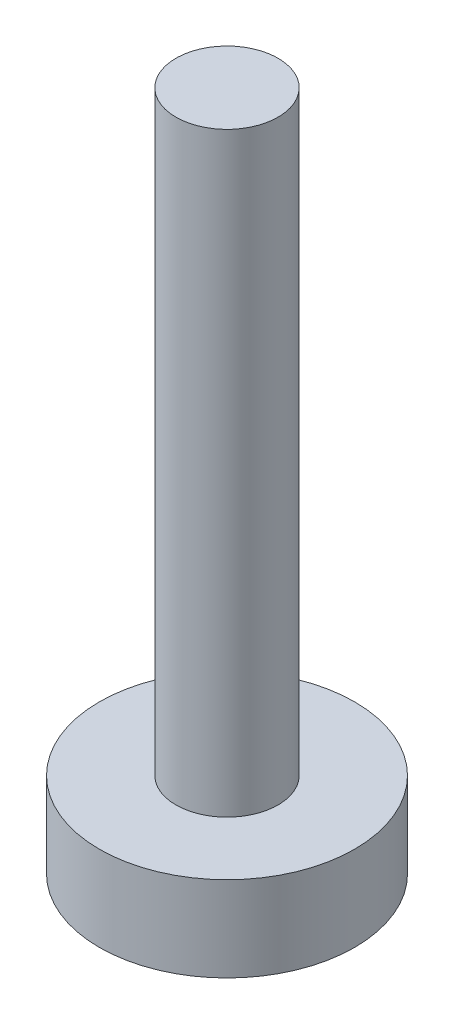
ISO-10303-21;
HEADER;
FILE_DESCRIPTION(('STEP AP214'),'2;1');
FILE_NAME('part.step','',(''),(''),'','','');
FILE_SCHEMA(('AUTOMOTIVE_DESIGN { 1 0 10303 214 1 1 1 1 }'));
ENDSEC;
DATA;
#1=APPLICATION_CONTEXT('core data for automotive mechanical design processes');
#2=APPLICATION_PROTOCOL_DEFINITION('international standard','automotive_design',2000,#1);
#3=PRODUCT_CONTEXT('',#1,'mechanical');
#4=PRODUCT('Part','Part','',(#3));
#5=PRODUCT_RELATED_PRODUCT_CATEGORY('part','',(#4));
#6=PRODUCT_DEFINITION_FORMATION('','',#4);
#7=PRODUCT_DEFINITION_CONTEXT('part definition',#1,'design');
#8=PRODUCT_DEFINITION('design','',#6,#7);
#9=PRODUCT_DEFINITION_SHAPE('','',#8);
#10=(LENGTH_UNIT() NAMED_UNIT(*) SI_UNIT(.MILLI.,.METRE.));
#11=(NAMED_UNIT(*) PLANE_ANGLE_UNIT() SI_UNIT($,.RADIAN.));
#12=(NAMED_UNIT(*) SI_UNIT($,.STERADIAN.) SOLID_ANGLE_UNIT());
#13=UNCERTAINTY_MEASURE_WITH_UNIT(LENGTH_MEASURE(1.E-05),#10,'distance_accuracy_value','');
#14=(GEOMETRIC_REPRESENTATION_CONTEXT(3) GLOBAL_UNCERTAINTY_ASSIGNED_CONTEXT((#13)) GLOBAL_UNIT_ASSIGNED_CONTEXT((#10,
#11,#12)) REPRESENTATION_CONTEXT('',''));
#15=CARTESIAN_POINT('',(0.,0.,0.));
#16=DIRECTION('',(0.,0.,1.));
#17=DIRECTION('',(1.,0.,0.));
#18=AXIS2_PLACEMENT_3D('',#15,#16,#17);
#19=CARTESIAN_POINT('',(0.,7.,0.));
#20=DIRECTION('',(0.,-1.,0.));
#21=DIRECTION('',(0.,0.,-1.));
#22=AXIS2_PLACEMENT_3D('',#19,#20,#21);
#23=CYLINDRICAL_SURFACE('',#22,0.6);
#24=CARTESIAN_POINT('',(0.,7.,0.));
#25=DIRECTION('',(0.,1.,0.));
#26=DIRECTION('',(0.,0.,1.));
#27=AXIS2_PLACEMENT_3D('',#24,#25,#26);
#28=CIRCLE('',#27,0.6);
#29=CARTESIAN_POINT('',(0.,7.,0.6));
#30=VERTEX_POINT('',#29);
#31=EDGE_CURVE('E10',#30,#30,#28,.T.);
#32=ORIENTED_EDGE('',*,*,#31,.F.);
#33=EDGE_LOOP('',(#32));
#34=FACE_BOUND('',#33,.T.);
#35=CARTESIAN_POINT('',(0.,0.,0.));
#36=DIRECTION('',(0.,1.,0.));
#37=DIRECTION('',(0.,0.,1.));
#38=AXIS2_PLACEMENT_3D('',#35,#36,#37);
#39=CIRCLE('',#38,0.6);
#40=CARTESIAN_POINT('',(0.,0.,0.6));
#41=VERTEX_POINT('',#40);
#42=EDGE_CURVE('E38',#41,#41,#39,.T.);
#43=ORIENTED_EDGE('',*,*,#42,.T.);
#44=EDGE_LOOP('',(#43));
#45=FACE_BOUND('',#44,.T.);
#46=ADVANCED_FACE('F35',(#34,#45),#23,.T.);
#47=CARTESIAN_POINT('',(0.,7.,0.));
#48=DIRECTION('',(0.,1.,0.));
#49=DIRECTION('',(0.,0.,1.));
#50=AXIS2_PLACEMENT_3D('',#47,#48,#49);
#51=PLANE('',#50);
#52=ORIENTED_EDGE('',*,*,#31,.T.);
#53=EDGE_LOOP('',(#52));
#54=FACE_BOUND('',#53,.T.);
#55=ADVANCED_FACE('F58',(#54),#51,.T.);
#56=CARTESIAN_POINT('',(0.,-1.,0.));
#57=DIRECTION('',(0.,1.,0.));
#58=DIRECTION('',(0.,0.,1.));
#59=AXIS2_PLACEMENT_3D('',#56,#57,#58);
#60=CYLINDRICAL_SURFACE('',#59,1.5);
#61=CARTESIAN_POINT('',(0.,-1.,0.));
#62=DIRECTION('',(0.,-1.,0.));
#63=DIRECTION('',(0.,0.,-1.));
#64=AXIS2_PLACEMENT_3D('',#61,#62,#63);
#65=CIRCLE('',#64,1.5);
#66=CARTESIAN_POINT('',(0.,-1.,-1.5));
#67=VERTEX_POINT('',#66);
#68=EDGE_CURVE('E45',#67,#67,#65,.T.);
#69=ORIENTED_EDGE('',*,*,#68,.F.);
#70=EDGE_LOOP('',(#69));
#71=FACE_BOUND('',#70,.T.);
#72=CARTESIAN_POINT('',(0.,0.,0.));
#73=DIRECTION('',(0.,-1.,0.));
#74=DIRECTION('',(0.,0.,-1.));
#75=AXIS2_PLACEMENT_3D('',#72,#73,#74);
#76=CIRCLE('',#75,1.5);
#77=CARTESIAN_POINT('',(0.,0.,-1.5));
#78=VERTEX_POINT('',#77);
#79=EDGE_CURVE('E47',#78,#78,#76,.T.);
#80=ORIENTED_EDGE('',*,*,#79,.T.);
#81=EDGE_LOOP('',(#80));
#82=FACE_BOUND('',#81,.T.);
#83=ADVANCED_FACE('F55',(#71,#82),#60,.T.);
#84=CARTESIAN_POINT('',(0.,-1.,0.));
#85=DIRECTION('',(0.,-1.,0.));
#86=DIRECTION('',(0.,0.,-1.));
#87=AXIS2_PLACEMENT_3D('',#84,#85,#86);
#88=PLANE('',#87);
#89=ORIENTED_EDGE('',*,*,#68,.T.);
#90=EDGE_LOOP('',(#89));
#91=FACE_BOUND('',#90,.T.);
#92=ADVANCED_FACE('F53',(#91),#88,.T.);
#93=CARTESIAN_POINT('',(0.,0.,0.));
#94=DIRECTION('',(0.,-1.,0.));
#95=DIRECTION('',(0.,0.,-1.));
#96=AXIS2_PLACEMENT_3D('',#93,#94,#95);
#97=PLANE('',#96);
#98=ORIENTED_EDGE('',*,*,#42,.F.);
#99=EDGE_LOOP('',(#98));
#100=FACE_BOUND('',#99,.T.);
#101=ORIENTED_EDGE('',*,*,#79,.F.);
#102=EDGE_LOOP('',(#101));
#103=FACE_BOUND('',#102,.T.);
#104=ADVANCED_FACE('F62',(#100,#103),#97,.F.);
#105=CLOSED_SHELL('',(#46,#55,#83,#92,#104));
#106=MANIFOLD_SOLID_BREP('B2',#105);
#107=ADVANCED_BREP_SHAPE_REPRESENTATION('',(#18,#106),#14);
#108=SHAPE_DEFINITION_REPRESENTATION(#9,#107);
ENDSEC;
END-ISO-10303-21;
